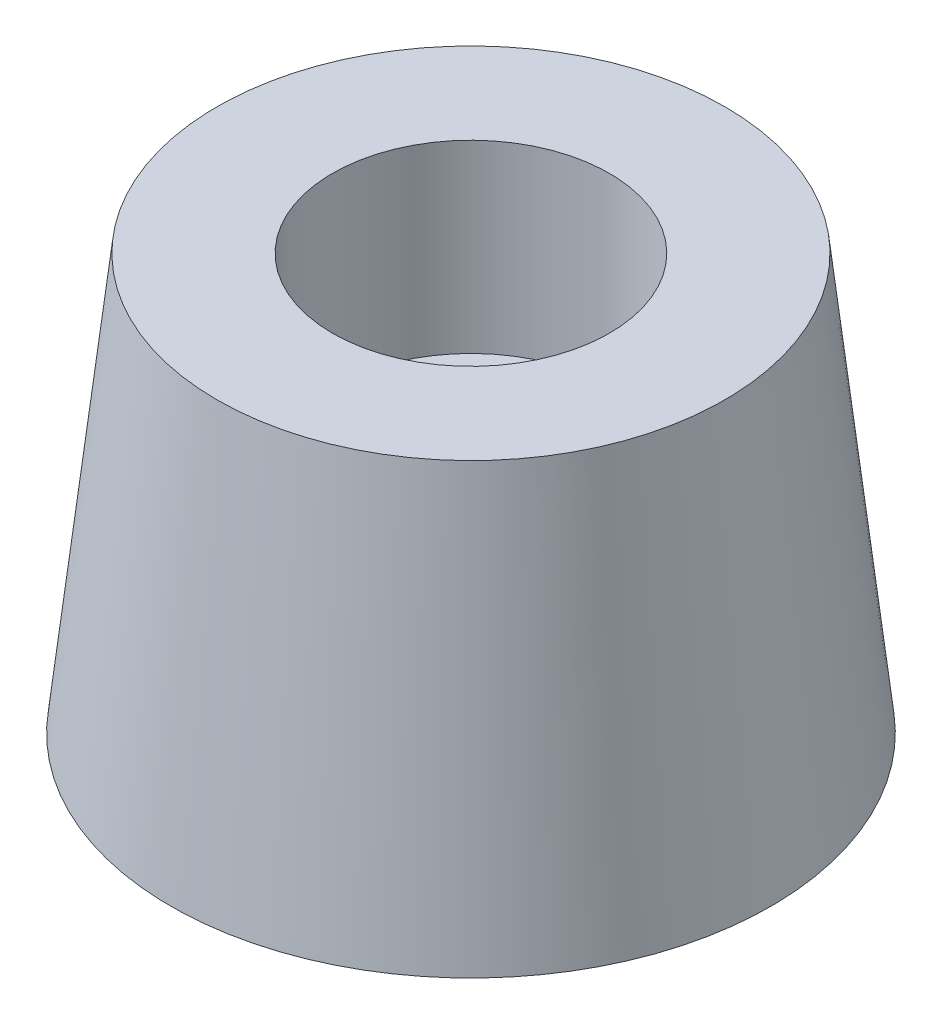
ISO-10303-21;
HEADER;
FILE_DESCRIPTION(('STEP AP214'),'2;1');
FILE_NAME('part.step','',(''),(''),'','','');
FILE_SCHEMA(('AUTOMOTIVE_DESIGN { 1 0 10303 214 1 1 1 1 }'));
ENDSEC;
DATA;
#1=APPLICATION_CONTEXT('core data for automotive mechanical design processes');
#2=APPLICATION_PROTOCOL_DEFINITION('international standard','automotive_design',2000,#1);
#3=PRODUCT_CONTEXT('',#1,'mechanical');
#4=PRODUCT('Part','Part','',(#3));
#5=PRODUCT_RELATED_PRODUCT_CATEGORY('part','',(#4));
#6=PRODUCT_DEFINITION_FORMATION('','',#4);
#7=PRODUCT_DEFINITION_CONTEXT('part definition',#1,'design');
#8=PRODUCT_DEFINITION('design','',#6,#7);
#9=PRODUCT_DEFINITION_SHAPE('','',#8);
#10=(LENGTH_UNIT() NAMED_UNIT(*) SI_UNIT(.MILLI.,.METRE.));
#11=(NAMED_UNIT(*) PLANE_ANGLE_UNIT() SI_UNIT($,.RADIAN.));
#12=(NAMED_UNIT(*) SI_UNIT($,.STERADIAN.) SOLID_ANGLE_UNIT());
#13=UNCERTAINTY_MEASURE_WITH_UNIT(LENGTH_MEASURE(1.E-05),#10,'distance_accuracy_value','');
#14=(GEOMETRIC_REPRESENTATION_CONTEXT(3) GLOBAL_UNCERTAINTY_ASSIGNED_CONTEXT((#13)) GLOBAL_UNIT_ASSIGNED_CONTEXT((#10,
#11,#12)) REPRESENTATION_CONTEXT('',''));
#15=CARTESIAN_POINT('',(0.,0.,0.));
#16=DIRECTION('',(0.,0.,1.));
#17=DIRECTION('',(1.,0.,0.));
#18=AXIS2_PLACEMENT_3D('',#15,#16,#17);
#19=CARTESIAN_POINT('',(0.,0.5,0.));
#20=DIRECTION('',(0.,1.,0.));
#21=DIRECTION('',(0.,0.,1.));
#22=AXIS2_PLACEMENT_3D('',#19,#20,#21);
#23=PLANE('',#22);
#24=CARTESIAN_POINT('',(0.,0.5,0.));
#25=DIRECTION('',(0.,1.,0.));
#26=DIRECTION('',(0.,0.,1.));
#27=AXIS2_PLACEMENT_3D('',#24,#25,#26);
#28=CIRCLE('',#27,1.5);
#29=CARTESIAN_POINT('',(0.,0.5,1.5));
#30=VERTEX_POINT('',#29);
#31=EDGE_CURVE('E18',#30,#30,#28,.F.);
#32=ORIENTED_EDGE('',*,*,#31,.T.);
#33=EDGE_LOOP('',(#32));
#34=FACE_BOUND('',#33,.T.);
#35=CARTESIAN_POINT('',(0.,0.5,0.));
#36=DIRECTION('',(0.,1.,0.));
#37=DIRECTION('',(0.,0.,1.));
#38=AXIS2_PLACEMENT_3D('',#35,#36,#37);
#39=CIRCLE('',#38,3.);
#40=CARTESIAN_POINT('',(0.,0.5,3.));
#41=VERTEX_POINT('',#40);
#42=EDGE_CURVE('E34',#41,#41,#39,.T.);
#43=ORIENTED_EDGE('',*,*,#42,.T.);
#44=EDGE_LOOP('',(#43));
#45=FACE_BOUND('',#44,.T.);
#46=ADVANCED_FACE('F15',(#34,#45),#23,.T.);
#47=CARTESIAN_POINT('',(0.,4.5,0.));
#48=DIRECTION('',(0.,1.,0.));
#49=DIRECTION('',(0.,0.,1.));
#50=AXIS2_PLACEMENT_3D('',#47,#48,#49);
#51=CYLINDRICAL_SURFACE('',#50,1.5);
#52=CARTESIAN_POINT('',(0.,-4.5,0.));
#53=DIRECTION('',(0.,1.,0.));
#54=DIRECTION('',(0.,0.,1.));
#55=AXIS2_PLACEMENT_3D('',#52,#53,#54);
#56=CIRCLE('',#55,1.5);
#57=CARTESIAN_POINT('',(0.,-4.5,1.5));
#58=VERTEX_POINT('',#57);
#59=EDGE_CURVE('E32',#58,#58,#56,.T.);
#60=ORIENTED_EDGE('',*,*,#59,.F.);
#61=EDGE_LOOP('',(#60));
#62=FACE_BOUND('',#61,.T.);
#63=ORIENTED_EDGE('',*,*,#31,.F.);
#64=EDGE_LOOP('',(#63));
#65=FACE_BOUND('',#64,.T.);
#66=ADVANCED_FACE('F42',(#62,#65),#51,.F.);
#67=CARTESIAN_POINT('',(0.,4.5,0.));
#68=DIRECTION('',(0.,1.,0.));
#69=DIRECTION('',(0.,0.,1.));
#70=AXIS2_PLACEMENT_3D('',#67,#68,#69);
#71=CYLINDRICAL_SURFACE('',#70,3.);
#72=ORIENTED_EDGE('',*,*,#42,.F.);
#73=EDGE_LOOP('',(#72));
#74=FACE_BOUND('',#73,.T.);
#75=CARTESIAN_POINT('',(0.,4.5,0.));
#76=DIRECTION('',(0.,1.,0.));
#77=DIRECTION('',(0.,0.,1.));
#78=AXIS2_PLACEMENT_3D('',#75,#76,#77);
#79=CIRCLE('',#78,3.);
#80=CARTESIAN_POINT('',(0.,4.5,3.));
#81=VERTEX_POINT('',#80);
#82=EDGE_CURVE('E27',#81,#81,#79,.T.);
#83=ORIENTED_EDGE('',*,*,#82,.T.);
#84=EDGE_LOOP('',(#83));
#85=FACE_BOUND('',#84,.T.);
#86=ADVANCED_FACE('F44',(#74,#85),#71,.F.);
#87=CARTESIAN_POINT('',(0.,-4.5,0.));
#88=DIRECTION('',(0.,-1.,0.));
#89=DIRECTION('',(0.,0.,-1.));
#90=AXIS2_PLACEMENT_3D('',#87,#88,#89);
#91=PLANE('',#90);
#92=ORIENTED_EDGE('',*,*,#59,.T.);
#93=EDGE_LOOP('',(#92));
#94=FACE_BOUND('',#93,.T.);
#95=CARTESIAN_POINT('',(0.,-4.50000000000728,0.));
#96=DIRECTION('',(0.,-1.,0.));
#97=DIRECTION('',(0.,0.,-1.));
#98=AXIS2_PLACEMENT_3D('',#95,#96,#97);
#99=CIRCLE('',#98,6.49999999999551);
#100=CARTESIAN_POINT('',(0.,-4.50000000000728,-6.49999999999551));
#101=VERTEX_POINT('',#100);
#102=EDGE_CURVE('E22',#101,#101,#99,.F.);
#103=ORIENTED_EDGE('',*,*,#102,.F.);
#104=EDGE_LOOP('',(#103));
#105=FACE_BOUND('',#104,.T.);
#106=ADVANCED_FACE('F51',(#94,#105),#91,.T.);
#107=CARTESIAN_POINT('',(0.,4.5,0.));
#108=DIRECTION('',(0.,-1.,0.));
#109=DIRECTION('',(0.,0.,-1.));
#110=AXIS2_PLACEMENT_3D('',#107,#108,#109);
#111=PLANE('',#110);
#112=ORIENTED_EDGE('',*,*,#82,.F.);
#113=EDGE_LOOP('',(#112));
#114=FACE_BOUND('',#113,.T.);
#115=CARTESIAN_POINT('',(0.,4.50000000000728,0.));
#116=DIRECTION('',(0.,-1.,0.));
#117=DIRECTION('',(0.,0.,-1.));
#118=AXIS2_PLACEMENT_3D('',#115,#116,#117);
#119=CIRCLE('',#118,5.49999999999784);
#120=CARTESIAN_POINT('',(0.,4.50000000000728,-5.49999999999784));
#121=VERTEX_POINT('',#120);
#122=EDGE_CURVE('E10',#121,#121,#119,.T.);
#123=ORIENTED_EDGE('',*,*,#122,.F.);
#124=EDGE_LOOP('',(#123));
#125=FACE_BOUND('',#124,.T.);
#126=ADVANCED_FACE('F57',(#114,#125),#111,.F.);
#127=CARTESIAN_POINT('',(0.,-4.50000000000728,0.));
#128=DIRECTION('',(0.,-1.,0.));
#129=DIRECTION('',(0.,0.,-1.));
#130=AXIS2_PLACEMENT_3D('',#127,#128,#129);
#131=CONICAL_SURFACE('',#130,6.49999999999551,0.110657221173462);
#132=ORIENTED_EDGE('',*,*,#122,.T.);
#133=EDGE_LOOP('',(#132));
#134=FACE_BOUND('',#133,.T.);
#135=ORIENTED_EDGE('',*,*,#102,.T.);
#136=EDGE_LOOP('',(#135));
#137=FACE_BOUND('',#136,.T.);
#138=ADVANCED_FACE('F55',(#134,#137),#131,.T.);
#139=CLOSED_SHELL('',(#46,#66,#86,#106,#126,#138));
#140=MANIFOLD_SOLID_BREP('B1',#139);
#141=ADVANCED_BREP_SHAPE_REPRESENTATION('',(#18,#140),#14);
#142=SHAPE_DEFINITION_REPRESENTATION(#9,#141);
ENDSEC;
END-ISO-10303-21;
